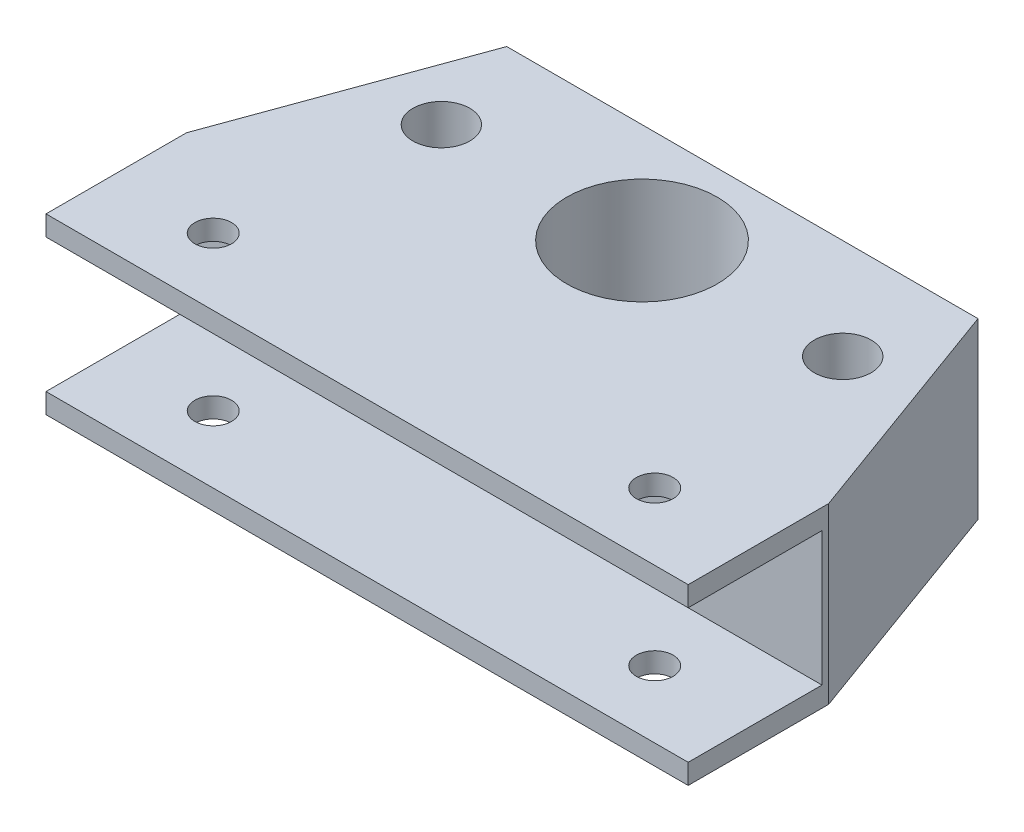
ISO-10303-21;
HEADER;
FILE_DESCRIPTION(('STEP AP214'),'2;1');
FILE_NAME('part.step','',(''),(''),'','','');
FILE_SCHEMA(('AUTOMOTIVE_DESIGN { 1 0 10303 214 1 1 1 1 }'));
ENDSEC;
DATA;
#1=APPLICATION_CONTEXT('core data for automotive mechanical design processes');
#2=APPLICATION_PROTOCOL_DEFINITION('international standard','automotive_design',2000,#1);
#3=PRODUCT_CONTEXT('',#1,'mechanical');
#4=PRODUCT('Part','Part','',(#3));
#5=PRODUCT_RELATED_PRODUCT_CATEGORY('part','',(#4));
#6=PRODUCT_DEFINITION_FORMATION('','',#4);
#7=PRODUCT_DEFINITION_CONTEXT('part definition',#1,'design');
#8=PRODUCT_DEFINITION('design','',#6,#7);
#9=PRODUCT_DEFINITION_SHAPE('','',#8);
#10=(LENGTH_UNIT() NAMED_UNIT(*) SI_UNIT(.MILLI.,.METRE.));
#11=(NAMED_UNIT(*) PLANE_ANGLE_UNIT() SI_UNIT($,.RADIAN.));
#12=(NAMED_UNIT(*) SI_UNIT($,.STERADIAN.) SOLID_ANGLE_UNIT());
#13=UNCERTAINTY_MEASURE_WITH_UNIT(LENGTH_MEASURE(1.E-05),#10,'distance_accuracy_value','');
#14=(GEOMETRIC_REPRESENTATION_CONTEXT(3) GLOBAL_UNCERTAINTY_ASSIGNED_CONTEXT((#13)) GLOBAL_UNIT_ASSIGNED_CONTEXT((#10,
#11,#12)) REPRESENTATION_CONTEXT('',''));
#15=CARTESIAN_POINT('',(0.,0.,0.));
#16=DIRECTION('',(0.,0.,1.));
#17=DIRECTION('',(1.,0.,0.));
#18=AXIS2_PLACEMENT_3D('',#15,#16,#17);
#19=CARTESIAN_POINT('',(-48.,13.,10.5));
#20=DIRECTION('',(0.,0.,-1.));
#21=DIRECTION('',(-1.,0.,0.));
#22=AXIS2_PLACEMENT_3D('',#19,#20,#21);
#23=PLANE('',#22);
#24=DIRECTION('',(0.,-1.,0.));
#25=VECTOR('',#24,1.);
#26=CARTESIAN_POINT('',(48.,13.,10.5));
#27=LINE('',#26,#25);
#28=CARTESIAN_POINT('',(48.,-9.99999999999999,10.5));
#29=VERTEX_POINT('',#28);
#30=CARTESIAN_POINT('',(48.,-13.,10.5));
#31=VERTEX_POINT('',#30);
#32=EDGE_CURVE('E163',#29,#31,#27,.T.);
#33=ORIENTED_EDGE('',*,*,#32,.F.);
#34=DIRECTION('',(-1.,0.,0.));
#35=VECTOR('',#34,1.);
#36=CARTESIAN_POINT('',(48.,-9.99999999999999,10.5));
#37=LINE('',#36,#35);
#38=CARTESIAN_POINT('',(-48.,-9.99999999999999,10.5));
#39=VERTEX_POINT('',#38);
#40=EDGE_CURVE('E207',#29,#39,#37,.T.);
#41=ORIENTED_EDGE('',*,*,#40,.T.);
#42=DIRECTION('',(0.,-1.,0.));
#43=VECTOR('',#42,1.);
#44=CARTESIAN_POINT('',(-48.,13.,10.5));
#45=LINE('',#44,#43);
#46=CARTESIAN_POINT('',(-48.,-13.,10.5));
#47=VERTEX_POINT('',#46);
#48=EDGE_CURVE('E136',#39,#47,#45,.T.);
#49=ORIENTED_EDGE('',*,*,#48,.T.);
#50=DIRECTION('',(1.,0.,0.));
#51=VECTOR('',#50,1.);
#52=CARTESIAN_POINT('',(-48.,-13.,10.5));
#53=LINE('',#52,#51);
#54=EDGE_CURVE('E157',#47,#31,#53,.T.);
#55=ORIENTED_EDGE('',*,*,#54,.T.);
#56=EDGE_LOOP('',(#33,#41,#49,#55));
#57=FACE_BOUND('',#56,.T.);
#58=ADVANCED_FACE('F41',(#57),#23,.F.);
#59=CARTESIAN_POINT('',(0.,13.,0.));
#60=DIRECTION('',(0.,1.,0.));
#61=DIRECTION('',(0.,0.,1.));
#62=AXIS2_PLACEMENT_3D('',#59,#60,#61);
#63=PLANE('',#62);
#64=CARTESIAN_POINT('',(-33.,13.,0.499999999999957));
#65=DIRECTION('',(0.,-1.,0.));
#66=DIRECTION('',(0.,0.,-1.));
#67=AXIS2_PLACEMENT_3D('',#64,#65,#66);
#68=CIRCLE('',#67,2.75);
#69=CARTESIAN_POINT('',(-33.,13.,-2.25000000000004));
#70=VERTEX_POINT('',#69);
#71=EDGE_CURVE('E170',#70,#70,#68,.T.);
#72=ORIENTED_EDGE('',*,*,#71,.T.);
#73=EDGE_LOOP('',(#72));
#74=FACE_BOUND('',#73,.T.);
#75=CARTESIAN_POINT('',(33.,13.,0.499999999999957));
#76=DIRECTION('',(0.,-1.,0.));
#77=DIRECTION('',(0.,0.,-1.));
#78=AXIS2_PLACEMENT_3D('',#75,#76,#77);
#79=CIRCLE('',#78,2.75);
#80=CARTESIAN_POINT('',(33.,13.,-2.25000000000004));
#81=VERTEX_POINT('',#80);
#82=EDGE_CURVE('E184',#81,#81,#79,.T.);
#83=ORIENTED_EDGE('',*,*,#82,.T.);
#84=EDGE_LOOP('',(#83));
#85=FACE_BOUND('',#84,.T.);
#86=CARTESIAN_POINT('',(-30.,13.,-30.5999999999998));
#87=DIRECTION('',(0.,1.,0.));
#88=DIRECTION('',(0.,0.,1.));
#89=AXIS2_PLACEMENT_3D('',#86,#87,#88);
#90=CIRCLE('',#89,4.25);
#91=CARTESIAN_POINT('',(-30.,13.,-34.8499999999998));
#92=VERTEX_POINT('',#91);
#93=EDGE_CURVE('E224',#92,#92,#90,.T.);
#94=ORIENTED_EDGE('',*,*,#93,.F.);
#95=EDGE_LOOP('',(#94));
#96=FACE_BOUND('',#95,.T.);
#97=DIRECTION('',(-0.342020143325666,0.,-0.939692620785909));
#98=VECTOR('',#97,1.);
#99=CARTESIAN_POINT('',(48.,13.,-10.5));
#100=LINE('',#99,#98);
#101=CARTESIAN_POINT('',(48.,13.,-10.5));
#102=VERTEX_POINT('',#101);
#103=CARTESIAN_POINT('',(35.2246447772564,13.,-45.6));
#104=VERTEX_POINT('',#103);
#105=EDGE_CURVE('E161',#102,#104,#100,.T.);
#106=ORIENTED_EDGE('',*,*,#105,.T.);
#107=DIRECTION('',(-1.,0.,0.));
#108=VECTOR('',#107,1.);
#109=CARTESIAN_POINT('',(35.2246447772564,13.,-45.6));
#110=LINE('',#109,#108);
#111=CARTESIAN_POINT('',(-35.2246447772564,13.,-45.6));
#112=VERTEX_POINT('',#111);
#113=EDGE_CURVE('E101',#104,#112,#110,.T.);
#114=ORIENTED_EDGE('',*,*,#113,.T.);
#115=DIRECTION('',(-0.342020143325666,0.,0.939692620785909));
#116=VECTOR('',#115,1.);
#117=CARTESIAN_POINT('',(-48.,13.,-10.5));
#118=LINE('',#117,#116);
#119=CARTESIAN_POINT('',(-48.,13.,-10.5));
#120=VERTEX_POINT('',#119);
#121=EDGE_CURVE('E119',#112,#120,#118,.T.);
#122=ORIENTED_EDGE('',*,*,#121,.T.);
#123=DIRECTION('',(0.,0.,1.));
#124=VECTOR('',#123,1.);
#125=CARTESIAN_POINT('',(-48.,13.,10.5));
#126=LINE('',#125,#124);
#127=CARTESIAN_POINT('',(-48.,13.,10.5));
#128=VERTEX_POINT('',#127);
#129=EDGE_CURVE('E111',#120,#128,#126,.T.);
#130=ORIENTED_EDGE('',*,*,#129,.T.);
#131=DIRECTION('',(1.,0.,0.));
#132=VECTOR('',#131,1.);
#133=CARTESIAN_POINT('',(-48.,13.,10.5));
#134=LINE('',#133,#132);
#135=CARTESIAN_POINT('',(48.,13.,10.5));
#136=VERTEX_POINT('',#135);
#137=EDGE_CURVE('E116',#128,#136,#134,.T.);
#138=ORIENTED_EDGE('',*,*,#137,.T.);
#139=DIRECTION('',(0.,0.,-1.));
#140=VECTOR('',#139,1.);
#141=CARTESIAN_POINT('',(48.,13.,10.5));
#142=LINE('',#141,#140);
#143=EDGE_CURVE('E67',#136,#102,#142,.T.);
#144=ORIENTED_EDGE('',*,*,#143,.T.);
#145=EDGE_LOOP('',(#106,#114,#122,#130,#138,#144));
#146=FACE_BOUND('',#145,.T.);
#147=CARTESIAN_POINT('',(0.,13.,-30.6));
#148=DIRECTION('',(0.,1.,0.));
#149=DIRECTION('',(0.,0.,1.));
#150=AXIS2_PLACEMENT_3D('',#147,#148,#149);
#151=CIRCLE('',#150,11.25);
#152=CARTESIAN_POINT('',(0.,13.,-41.85));
#153=VERTEX_POINT('',#152);
#154=EDGE_CURVE('E150',#153,#153,#151,.T.);
#155=ORIENTED_EDGE('',*,*,#154,.F.);
#156=EDGE_LOOP('',(#155));
#157=FACE_BOUND('',#156,.T.);
#158=CARTESIAN_POINT('',(30.,13.,-30.5999999999998));
#159=DIRECTION('',(0.,1.,0.));
#160=DIRECTION('',(0.,0.,-1.));
#161=AXIS2_PLACEMENT_3D('',#158,#159,#160);
#162=CIRCLE('',#161,4.25);
#163=CARTESIAN_POINT('',(30.,13.,-34.8499999999998));
#164=VERTEX_POINT('',#163);
#165=EDGE_CURVE('E218',#164,#164,#162,.T.);
#166=ORIENTED_EDGE('',*,*,#165,.F.);
#167=EDGE_LOOP('',(#166));
#168=FACE_BOUND('',#167,.T.);
#169=ADVANCED_FACE('F113',(#74,#85,#96,#146,#157,#168),#63,.T.);
#170=CARTESIAN_POINT('',(0.,-13.,0.));
#171=DIRECTION('',(0.,1.,0.));
#172=DIRECTION('',(0.,0.,1.));
#173=AXIS2_PLACEMENT_3D('',#170,#171,#172);
#174=PLANE('',#173);
#175=CARTESIAN_POINT('',(-33.,-13.,0.499999999999957));
#176=DIRECTION('',(0.,-1.,0.));
#177=DIRECTION('',(0.,0.,-1.));
#178=AXIS2_PLACEMENT_3D('',#175,#176,#177);
#179=CIRCLE('',#178,2.75);
#180=CARTESIAN_POINT('',(-33.,-13.,-2.25000000000004));
#181=VERTEX_POINT('',#180);
#182=EDGE_CURVE('E176',#181,#181,#179,.T.);
#183=ORIENTED_EDGE('',*,*,#182,.F.);
#184=EDGE_LOOP('',(#183));
#185=FACE_BOUND('',#184,.T.);
#186=CARTESIAN_POINT('',(33.,-13.,0.499999999999957));
#187=DIRECTION('',(0.,-1.,0.));
#188=DIRECTION('',(0.,0.,-1.));
#189=AXIS2_PLACEMENT_3D('',#186,#187,#188);
#190=CIRCLE('',#189,2.75);
#191=CARTESIAN_POINT('',(33.,-13.,-2.25000000000004));
#192=VERTEX_POINT('',#191);
#193=EDGE_CURVE('E181',#192,#192,#190,.T.);
#194=ORIENTED_EDGE('',*,*,#193,.F.);
#195=EDGE_LOOP('',(#194));
#196=FACE_BOUND('',#195,.T.);
#197=DIRECTION('',(-0.342020143325666,0.,-0.939692620785909));
#198=VECTOR('',#197,1.);
#199=CARTESIAN_POINT('',(48.,-13.,-10.5));
#200=LINE('',#199,#198);
#201=CARTESIAN_POINT('',(48.,-13.,-10.5));
#202=VERTEX_POINT('',#201);
#203=CARTESIAN_POINT('',(35.2246447772564,-13.,-45.6));
#204=VERTEX_POINT('',#203);
#205=EDGE_CURVE('E146',#202,#204,#200,.T.);
#206=ORIENTED_EDGE('',*,*,#205,.F.);
#207=DIRECTION('',(0.,0.,-1.));
#208=VECTOR('',#207,1.);
#209=CARTESIAN_POINT('',(48.,-13.,10.5));
#210=LINE('',#209,#208);
#211=EDGE_CURVE('E93',#31,#202,#210,.T.);
#212=ORIENTED_EDGE('',*,*,#211,.F.);
#213=ORIENTED_EDGE('',*,*,#54,.F.);
#214=DIRECTION('',(0.,0.,1.));
#215=VECTOR('',#214,1.);
#216=CARTESIAN_POINT('',(-48.,-13.,10.5));
#217=LINE('',#216,#215);
#218=CARTESIAN_POINT('',(-48.,-13.,-10.5));
#219=VERTEX_POINT('',#218);
#220=EDGE_CURVE('E154',#219,#47,#217,.T.);
#221=ORIENTED_EDGE('',*,*,#220,.F.);
#222=DIRECTION('',(-0.342020143325666,0.,0.939692620785909));
#223=VECTOR('',#222,1.);
#224=CARTESIAN_POINT('',(-48.,-13.,-10.5));
#225=LINE('',#224,#223);
#226=CARTESIAN_POINT('',(-35.2246447772564,-13.,-45.6));
#227=VERTEX_POINT('',#226);
#228=EDGE_CURVE('E152',#227,#219,#225,.T.);
#229=ORIENTED_EDGE('',*,*,#228,.F.);
#230=DIRECTION('',(-1.,0.,0.));
#231=VECTOR('',#230,1.);
#232=CARTESIAN_POINT('',(-35.2246447772564,-13.,-45.6));
#233=LINE('',#232,#231);
#234=EDGE_CURVE('E149',#204,#227,#233,.T.);
#235=ORIENTED_EDGE('',*,*,#234,.F.);
#236=EDGE_LOOP('',(#206,#212,#213,#221,#229,#235));
#237=FACE_BOUND('',#236,.T.);
#238=CARTESIAN_POINT('',(0.,-13.,-30.6));
#239=DIRECTION('',(0.,1.,0.));
#240=DIRECTION('',(0.,0.,1.));
#241=AXIS2_PLACEMENT_3D('',#238,#239,#240);
#242=CIRCLE('',#241,11.25);
#243=CARTESIAN_POINT('',(0.,-13.,-41.85));
#244=VERTEX_POINT('',#243);
#245=EDGE_CURVE('E227',#244,#244,#242,.T.);
#246=ORIENTED_EDGE('',*,*,#245,.T.);
#247=EDGE_LOOP('',(#246));
#248=FACE_BOUND('',#247,.T.);
#249=CARTESIAN_POINT('',(-30.,-13.,-30.5999999999998));
#250=DIRECTION('',(0.,1.,0.));
#251=DIRECTION('',(0.,0.,1.));
#252=AXIS2_PLACEMENT_3D('',#249,#250,#251);
#253=CIRCLE('',#252,4.25);
#254=CARTESIAN_POINT('',(-30.,-13.,-34.8499999999998));
#255=VERTEX_POINT('',#254);
#256=EDGE_CURVE('E221',#255,#255,#253,.T.);
#257=ORIENTED_EDGE('',*,*,#256,.T.);
#258=EDGE_LOOP('',(#257));
#259=FACE_BOUND('',#258,.T.);
#260=CARTESIAN_POINT('',(30.,-13.,-30.5999999999998));
#261=DIRECTION('',(0.,1.,0.));
#262=DIRECTION('',(0.,0.,-1.));
#263=AXIS2_PLACEMENT_3D('',#260,#261,#262);
#264=CIRCLE('',#263,4.25);
#265=CARTESIAN_POINT('',(30.,-13.,-34.8499999999998));
#266=VERTEX_POINT('',#265);
#267=EDGE_CURVE('E210',#266,#266,#264,.T.);
#268=ORIENTED_EDGE('',*,*,#267,.T.);
#269=EDGE_LOOP('',(#268));
#270=FACE_BOUND('',#269,.T.);
#271=ADVANCED_FACE('F245',(#185,#196,#237,#248,#259,#270),#174,.F.);
#272=CARTESIAN_POINT('',(48.,13.,-10.5));
#273=DIRECTION('',(-0.939692620785909,0.,0.342020143325666));
#274=DIRECTION('',(0.342020143325666,0.,0.939692620785909));
#275=AXIS2_PLACEMENT_3D('',#272,#273,#274);
#276=PLANE('',#275);
#277=ORIENTED_EDGE('',*,*,#205,.T.);
#278=DIRECTION('',(0.,-1.,0.));
#279=VECTOR('',#278,1.);
#280=CARTESIAN_POINT('',(35.2246447772564,13.,-45.6));
#281=LINE('',#280,#279);
#282=EDGE_CURVE('E11',#104,#204,#281,.T.);
#283=ORIENTED_EDGE('',*,*,#282,.F.);
#284=ORIENTED_EDGE('',*,*,#105,.F.);
#285=DIRECTION('',(0.,-1.,0.));
#286=VECTOR('',#285,1.);
#287=CARTESIAN_POINT('',(48.,13.,-10.5));
#288=LINE('',#287,#286);
#289=EDGE_CURVE('E142',#102,#202,#288,.T.);
#290=ORIENTED_EDGE('',*,*,#289,.T.);
#291=EDGE_LOOP('',(#277,#283,#284,#290));
#292=FACE_BOUND('',#291,.T.);
#293=ADVANCED_FACE('F43',(#292),#276,.F.);
#294=CARTESIAN_POINT('',(-35.2246447772564,13.,-45.6));
#295=DIRECTION('',(0.,0.,1.));
#296=DIRECTION('',(1.,0.,0.));
#297=AXIS2_PLACEMENT_3D('',#294,#295,#296);
#298=PLANE('',#297);
#299=ORIENTED_EDGE('',*,*,#234,.T.);
#300=DIRECTION('',(0.,-1.,0.));
#301=VECTOR('',#300,1.);
#302=CARTESIAN_POINT('',(-35.2246447772564,13.,-45.6));
#303=LINE('',#302,#301);
#304=EDGE_CURVE('E50',#112,#227,#303,.T.);
#305=ORIENTED_EDGE('',*,*,#304,.F.);
#306=ORIENTED_EDGE('',*,*,#113,.F.);
#307=ORIENTED_EDGE('',*,*,#282,.T.);
#308=EDGE_LOOP('',(#299,#305,#306,#307));
#309=FACE_BOUND('',#308,.T.);
#310=ADVANCED_FACE('F237',(#309),#298,.F.);
#311=CARTESIAN_POINT('',(-48.,13.,-10.5));
#312=DIRECTION('',(0.939692620785909,0.,0.342020143325666));
#313=DIRECTION('',(0.342020143325666,0.,-0.939692620785909));
#314=AXIS2_PLACEMENT_3D('',#311,#312,#313);
#315=PLANE('',#314);
#316=ORIENTED_EDGE('',*,*,#228,.T.);
#317=DIRECTION('',(0.,-1.,0.));
#318=VECTOR('',#317,1.);
#319=CARTESIAN_POINT('',(-48.,13.,-10.5));
#320=LINE('',#319,#318);
#321=EDGE_CURVE('E135',#120,#219,#320,.T.);
#322=ORIENTED_EDGE('',*,*,#321,.F.);
#323=ORIENTED_EDGE('',*,*,#121,.F.);
#324=ORIENTED_EDGE('',*,*,#304,.T.);
#325=EDGE_LOOP('',(#316,#322,#323,#324));
#326=FACE_BOUND('',#325,.T.);
#327=ADVANCED_FACE('F240',(#326),#315,.F.);
#328=CARTESIAN_POINT('',(-48.,13.,10.5));
#329=DIRECTION('',(1.,0.,0.));
#330=DIRECTION('',(0.,0.,-1.));
#331=AXIS2_PLACEMENT_3D('',#328,#329,#330);
#332=PLANE('',#331);
#333=ORIENTED_EDGE('',*,*,#48,.F.);
#334=DIRECTION('',(0.,0.,1.));
#335=VECTOR('',#334,1.);
#336=CARTESIAN_POINT('',(-48.,-9.99999999999999,-9.50000000000003));
#337=LINE('',#336,#335);
#338=CARTESIAN_POINT('',(-48.,-9.99999999999999,-9.50000000000003));
#339=VERTEX_POINT('',#338);
#340=EDGE_CURVE('E195',#339,#39,#337,.T.);
#341=ORIENTED_EDGE('',*,*,#340,.F.);
#342=DIRECTION('',(0.,-1.,0.));
#343=VECTOR('',#342,1.);
#344=CARTESIAN_POINT('',(-48.,9.99999999999999,-9.50000000000004));
#345=LINE('',#344,#343);
#346=CARTESIAN_POINT('',(-48.,9.99999999999999,-9.50000000000004));
#347=VERTEX_POINT('',#346);
#348=EDGE_CURVE('E202',#347,#339,#345,.T.);
#349=ORIENTED_EDGE('',*,*,#348,.F.);
#350=DIRECTION('',(0.,0.,-1.));
#351=VECTOR('',#350,1.);
#352=CARTESIAN_POINT('',(-48.,9.99999999999999,-9.50000000000004));
#353=LINE('',#352,#351);
#354=CARTESIAN_POINT('',(-48.,9.99999999999999,10.5));
#355=VERTEX_POINT('',#354);
#356=EDGE_CURVE('E132',#355,#347,#353,.T.);
#357=ORIENTED_EDGE('',*,*,#356,.F.);
#358=EDGE_CURVE('E126',#128,#355,#45,.T.);
#359=ORIENTED_EDGE('',*,*,#358,.F.);
#360=ORIENTED_EDGE('',*,*,#129,.F.);
#361=ORIENTED_EDGE('',*,*,#321,.T.);
#362=ORIENTED_EDGE('',*,*,#220,.T.);
#363=EDGE_LOOP('',(#333,#341,#349,#357,#359,#360,#361,#362));
#364=FACE_BOUND('',#363,.T.);
#365=ADVANCED_FACE('F128',(#364),#332,.F.);
#366=ORIENTED_EDGE('',*,*,#358,.T.);
#367=DIRECTION('',(-1.,0.,0.));
#368=VECTOR('',#367,1.);
#369=CARTESIAN_POINT('',(48.,9.99999999999999,10.5));
#370=LINE('',#369,#368);
#371=CARTESIAN_POINT('',(48.,9.99999999999999,10.5));
#372=VERTEX_POINT('',#371);
#373=EDGE_CURVE('E200',#372,#355,#370,.T.);
#374=ORIENTED_EDGE('',*,*,#373,.F.);
#375=EDGE_CURVE('E140',#136,#372,#27,.T.);
#376=ORIENTED_EDGE('',*,*,#375,.F.);
#377=ORIENTED_EDGE('',*,*,#137,.F.);
#378=EDGE_LOOP('',(#366,#374,#376,#377));
#379=FACE_BOUND('',#378,.T.);
#380=ADVANCED_FACE('F138',(#379),#23,.F.);
#381=CARTESIAN_POINT('',(48.,13.,10.5));
#382=DIRECTION('',(-1.,0.,0.));
#383=DIRECTION('',(0.,0.,1.));
#384=AXIS2_PLACEMENT_3D('',#381,#382,#383);
#385=PLANE('',#384);
#386=DIRECTION('',(0.,-1.,0.));
#387=VECTOR('',#386,1.);
#388=CARTESIAN_POINT('',(48.,9.99999999999999,-9.50000000000004));
#389=LINE('',#388,#387);
#390=CARTESIAN_POINT('',(48.,9.99999999999999,-9.50000000000004));
#391=VERTEX_POINT('',#390);
#392=CARTESIAN_POINT('',(48.,-9.99999999999999,-9.50000000000003));
#393=VERTEX_POINT('',#392);
#394=EDGE_CURVE('E58',#391,#393,#389,.T.);
#395=ORIENTED_EDGE('',*,*,#394,.T.);
#396=DIRECTION('',(0.,0.,1.));
#397=VECTOR('',#396,1.);
#398=CARTESIAN_POINT('',(48.,-9.99999999999999,-9.50000000000003));
#399=LINE('',#398,#397);
#400=EDGE_CURVE('E197',#393,#29,#399,.T.);
#401=ORIENTED_EDGE('',*,*,#400,.T.);
#402=ORIENTED_EDGE('',*,*,#32,.T.);
#403=ORIENTED_EDGE('',*,*,#211,.T.);
#404=ORIENTED_EDGE('',*,*,#289,.F.);
#405=ORIENTED_EDGE('',*,*,#143,.F.);
#406=ORIENTED_EDGE('',*,*,#375,.T.);
#407=DIRECTION('',(0.,0.,-1.));
#408=VECTOR('',#407,1.);
#409=CARTESIAN_POINT('',(48.,9.99999999999999,-9.50000000000004));
#410=LINE('',#409,#408);
#411=EDGE_CURVE('E192',#372,#391,#410,.T.);
#412=ORIENTED_EDGE('',*,*,#411,.T.);
#413=EDGE_LOOP('',(#395,#401,#402,#403,#404,#405,#406,#412));
#414=FACE_BOUND('',#413,.T.);
#415=ADVANCED_FACE('F265',(#414),#385,.F.);
#416=CARTESIAN_POINT('',(0.,13.,-30.6));
#417=DIRECTION('',(0.,-1.,0.));
#418=DIRECTION('',(0.,0.,-1.));
#419=AXIS2_PLACEMENT_3D('',#416,#417,#418);
#420=CYLINDRICAL_SURFACE('',#419,11.25);
#421=CARTESIAN_POINT('',(0.,13.,-41.85));
#422=CARTESIAN_POINT('',(0.,12.7291666666667,-41.85));
#423=CARTESIAN_POINT('',(0.,12.4583333333333,-41.85));
#424=CARTESIAN_POINT('',(0.,11.9166666666667,-41.85));
#425=CARTESIAN_POINT('',(0.,11.6458333333333,-41.85));
#426=CARTESIAN_POINT('',(0.,11.1041666666667,-41.85));
#427=CARTESIAN_POINT('',(0.,10.8333333333333,-41.85));
#428=CARTESIAN_POINT('',(0.,10.2916666666667,-41.85));
#429=CARTESIAN_POINT('',(0.,10.0208333333333,-41.85));
#430=CARTESIAN_POINT('',(0.,9.47916666666667,-41.85));
#431=CARTESIAN_POINT('',(0.,9.20833333333333,-41.85));
#432=CARTESIAN_POINT('',(0.,8.66666666666667,-41.85));
#433=CARTESIAN_POINT('',(0.,8.39583333333333,-41.85));
#434=CARTESIAN_POINT('',(0.,7.85416666666667,-41.85));
#435=CARTESIAN_POINT('',(0.,7.58333333333333,-41.85));
#436=CARTESIAN_POINT('',(0.,7.04166666666667,-41.85));
#437=CARTESIAN_POINT('',(0.,6.77083333333333,-41.85));
#438=CARTESIAN_POINT('',(0.,6.22916666666667,-41.85));
#439=CARTESIAN_POINT('',(0.,5.95833333333333,-41.85));
#440=CARTESIAN_POINT('',(0.,5.41666666666667,-41.85));
#441=CARTESIAN_POINT('',(0.,5.14583333333333,-41.85));
#442=CARTESIAN_POINT('',(0.,4.60416666666667,-41.85));
#443=CARTESIAN_POINT('',(0.,4.33333333333333,-41.85));
#444=CARTESIAN_POINT('',(0.,3.79166666666667,-41.85));
#445=CARTESIAN_POINT('',(0.,3.52083333333333,-41.85));
#446=CARTESIAN_POINT('',(0.,2.97916666666666,-41.85));
#447=CARTESIAN_POINT('',(0.,2.70833333333333,-41.85));
#448=CARTESIAN_POINT('',(0.,2.16666666666667,-41.85));
#449=CARTESIAN_POINT('',(0.,1.89583333333333,-41.85));
#450=CARTESIAN_POINT('',(0.,1.35416666666666,-41.85));
#451=CARTESIAN_POINT('',(0.,1.08333333333333,-41.85));
#452=CARTESIAN_POINT('',(0.,0.541666666666665,-41.85));
#453=CARTESIAN_POINT('',(0.,0.270833333333332,-41.85));
#454=CARTESIAN_POINT('',(0.,-0.270833333333335,-41.85));
#455=CARTESIAN_POINT('',(0.,-0.541666666666669,-41.85));
#456=CARTESIAN_POINT('',(0.,-1.08333333333334,-41.85));
#457=CARTESIAN_POINT('',(0.,-1.35416666666667,-41.85));
#458=CARTESIAN_POINT('',(0.,-1.89583333333333,-41.85));
#459=CARTESIAN_POINT('',(0.,-2.16666666666667,-41.85));
#460=CARTESIAN_POINT('',(0.,-2.70833333333333,-41.85));
#461=CARTESIAN_POINT('',(0.,-2.97916666666667,-41.85));
#462=CARTESIAN_POINT('',(0.,-3.52083333333333,-41.85));
#463=CARTESIAN_POINT('',(0.,-3.79166666666667,-41.85));
#464=CARTESIAN_POINT('',(0.,-4.33333333333333,-41.85));
#465=CARTESIAN_POINT('',(0.,-4.60416666666667,-41.85));
#466=CARTESIAN_POINT('',(0.,-5.14583333333333,-41.85));
#467=CARTESIAN_POINT('',(0.,-5.41666666666667,-41.85));
#468=CARTESIAN_POINT('',(0.,-5.95833333333333,-41.85));
#469=CARTESIAN_POINT('',(0.,-6.22916666666667,-41.85));
#470=CARTESIAN_POINT('',(0.,-6.77083333333333,-41.85));
#471=CARTESIAN_POINT('',(0.,-7.04166666666667,-41.85));
#472=CARTESIAN_POINT('',(0.,-7.58333333333333,-41.85));
#473=CARTESIAN_POINT('',(0.,-7.85416666666667,-41.85));
#474=CARTESIAN_POINT('',(0.,-8.39583333333333,-41.85));
#475=CARTESIAN_POINT('',(0.,-8.66666666666667,-41.85));
#476=CARTESIAN_POINT('',(0.,-9.20833333333333,-41.85));
#477=CARTESIAN_POINT('',(0.,-9.47916666666667,-41.85));
#478=CARTESIAN_POINT('',(0.,-10.0208333333333,-41.85));
#479=CARTESIAN_POINT('',(0.,-10.2916666666667,-41.85));
#480=CARTESIAN_POINT('',(0.,-10.8333333333333,-41.85));
#481=CARTESIAN_POINT('',(0.,-11.1041666666667,-41.85));
#482=CARTESIAN_POINT('',(0.,-11.6458333333333,-41.85));
#483=CARTESIAN_POINT('',(0.,-11.9166666666667,-41.85));
#484=CARTESIAN_POINT('',(0.,-12.4583333333333,-41.85));
#485=CARTESIAN_POINT('',(0.,-12.7291666666667,-41.85));
#486=CARTESIAN_POINT('',(0.,-13.,-41.85));
#487=B_SPLINE_CURVE_WITH_KNOTS('',3,(#421,#422,#423,#424,#425,#426,#427,#428,#429,#430,#431,
#432,#433,#434,#435,#436,#437,#438,#439,#440,#441,#442,#443,#444,#445,#446,#447,#448,#449,#450,
#451,#452,#453,#454,#455,#456,#457,#458,#459,#460,#461,#462,#463,#464,#465,#466,#467,#468,#469,
#470,#471,#472,#473,#474,#475,#476,#477,#478,#479,#480,#481,#482,#483,#484,#485,#486),
.UNSPECIFIED.,.F.,.F.,(4,2,2,2,2,2,2,2,2,2,2,2,2,2,2,2,2,2,2,2,2,2,2,2,2,2,2,2,2,2,2,2,4),(0.,
0.812499999999999,1.625,2.4375,3.25,4.0625,4.875,5.6875,6.5,7.3125,8.125,8.9375,9.75,10.5625,
11.375,12.1875,13.,13.8125,14.625,15.4375,16.25,17.0625,17.875,18.6875,19.5,20.3125,21.125,
21.9375,22.75,23.5625,24.375,25.1875,26.),.UNSPECIFIED.);
#488=EDGE_CURVE('BSEAM299',#153,#244,#487,.T.);
#489=ORIENTED_EDGE('',*,*,#154,.T.);
#490=ORIENTED_EDGE('',*,*,#245,.F.);
#491=ORIENTED_EDGE('',*,*,#488,.T.);
#492=ORIENTED_EDGE('',*,*,#488,.F.);
#493=EDGE_LOOP('',(#489,#491,#490,#492));
#494=FACE_BOUND('',#493,.T.);
#495=ADVANCED_FACE('F299',(#494),#420,.F.);
#496=CARTESIAN_POINT('',(-30.,13.,-30.5999999999998));
#497=DIRECTION('',(0.,-1.,0.));
#498=DIRECTION('',(0.,0.,-1.));
#499=AXIS2_PLACEMENT_3D('',#496,#497,#498);
#500=CYLINDRICAL_SURFACE('',#499,4.25);
#501=CARTESIAN_POINT('',(-30.,13.,-34.8499999999998));
#502=CARTESIAN_POINT('',(-30.,12.7291666666667,-34.8499999999998));
#503=CARTESIAN_POINT('',(-30.,12.4583333333333,-34.8499999999998));
#504=CARTESIAN_POINT('',(-30.,11.9166666666667,-34.8499999999998));
#505=CARTESIAN_POINT('',(-30.,11.6458333333333,-34.8499999999998));
#506=CARTESIAN_POINT('',(-30.,11.1041666666667,-34.8499999999998));
#507=CARTESIAN_POINT('',(-30.,10.8333333333333,-34.8499999999998));
#508=CARTESIAN_POINT('',(-30.,10.2916666666667,-34.8499999999998));
#509=CARTESIAN_POINT('',(-30.,10.0208333333333,-34.8499999999998));
#510=CARTESIAN_POINT('',(-30.,9.47916666666667,-34.8499999999998));
#511=CARTESIAN_POINT('',(-30.,9.20833333333333,-34.8499999999998));
#512=CARTESIAN_POINT('',(-30.,8.66666666666667,-34.8499999999998));
#513=CARTESIAN_POINT('',(-30.,8.39583333333333,-34.8499999999998));
#514=CARTESIAN_POINT('',(-30.,7.85416666666667,-34.8499999999998));
#515=CARTESIAN_POINT('',(-30.,7.58333333333333,-34.8499999999998));
#516=CARTESIAN_POINT('',(-30.,7.04166666666667,-34.8499999999998));
#517=CARTESIAN_POINT('',(-30.,6.77083333333333,-34.8499999999998));
#518=CARTESIAN_POINT('',(-30.,6.22916666666667,-34.8499999999998));
#519=CARTESIAN_POINT('',(-30.,5.95833333333333,-34.8499999999998));
#520=CARTESIAN_POINT('',(-30.,5.41666666666667,-34.8499999999998));
#521=CARTESIAN_POINT('',(-30.,5.14583333333333,-34.8499999999998));
#522=CARTESIAN_POINT('',(-30.,4.60416666666667,-34.8499999999998));
#523=CARTESIAN_POINT('',(-30.,4.33333333333333,-34.8499999999998));
#524=CARTESIAN_POINT('',(-30.,3.79166666666667,-34.8499999999998));
#525=CARTESIAN_POINT('',(-30.,3.52083333333333,-34.8499999999998));
#526=CARTESIAN_POINT('',(-30.,2.97916666666666,-34.8499999999998));
#527=CARTESIAN_POINT('',(-30.,2.70833333333333,-34.8499999999998));
#528=CARTESIAN_POINT('',(-30.,2.16666666666667,-34.8499999999998));
#529=CARTESIAN_POINT('',(-30.,1.89583333333333,-34.8499999999998));
#530=CARTESIAN_POINT('',(-30.,1.35416666666666,-34.8499999999998));
#531=CARTESIAN_POINT('',(-30.,1.08333333333333,-34.8499999999998));
#532=CARTESIAN_POINT('',(-30.,0.541666666666665,-34.8499999999998));
#533=CARTESIAN_POINT('',(-30.,0.270833333333332,-34.8499999999998));
#534=CARTESIAN_POINT('',(-30.,-0.270833333333335,-34.8499999999998));
#535=CARTESIAN_POINT('',(-30.,-0.541666666666669,-34.8499999999998));
#536=CARTESIAN_POINT('',(-30.,-1.08333333333334,-34.8499999999998));
#537=CARTESIAN_POINT('',(-30.,-1.35416666666667,-34.8499999999998));
#538=CARTESIAN_POINT('',(-30.,-1.89583333333333,-34.8499999999998));
#539=CARTESIAN_POINT('',(-30.,-2.16666666666667,-34.8499999999998));
#540=CARTESIAN_POINT('',(-30.,-2.70833333333333,-34.8499999999998));
#541=CARTESIAN_POINT('',(-30.,-2.97916666666667,-34.8499999999998));
#542=CARTESIAN_POINT('',(-30.,-3.52083333333333,-34.8499999999998));
#543=CARTESIAN_POINT('',(-30.,-3.79166666666667,-34.8499999999998));
#544=CARTESIAN_POINT('',(-30.,-4.33333333333333,-34.8499999999998));
#545=CARTESIAN_POINT('',(-30.,-4.60416666666667,-34.8499999999998));
#546=CARTESIAN_POINT('',(-30.,-5.14583333333333,-34.8499999999998));
#547=CARTESIAN_POINT('',(-30.,-5.41666666666667,-34.8499999999998));
#548=CARTESIAN_POINT('',(-30.,-5.95833333333333,-34.8499999999998));
#549=CARTESIAN_POINT('',(-30.,-6.22916666666667,-34.8499999999998));
#550=CARTESIAN_POINT('',(-30.,-6.77083333333333,-34.8499999999998));
#551=CARTESIAN_POINT('',(-30.,-7.04166666666667,-34.8499999999998));
#552=CARTESIAN_POINT('',(-30.,-7.58333333333333,-34.8499999999998));
#553=CARTESIAN_POINT('',(-30.,-7.85416666666667,-34.8499999999998));
#554=CARTESIAN_POINT('',(-30.,-8.39583333333333,-34.8499999999998));
#555=CARTESIAN_POINT('',(-30.,-8.66666666666667,-34.8499999999998));
#556=CARTESIAN_POINT('',(-30.,-9.20833333333333,-34.8499999999998));
#557=CARTESIAN_POINT('',(-30.,-9.47916666666667,-34.8499999999998));
#558=CARTESIAN_POINT('',(-30.,-10.0208333333333,-34.8499999999998));
#559=CARTESIAN_POINT('',(-30.,-10.2916666666667,-34.8499999999998));
#560=CARTESIAN_POINT('',(-30.,-10.8333333333333,-34.8499999999998));
#561=CARTESIAN_POINT('',(-30.,-11.1041666666667,-34.8499999999998));
#562=CARTESIAN_POINT('',(-30.,-11.6458333333333,-34.8499999999998));
#563=CARTESIAN_POINT('',(-30.,-11.9166666666667,-34.8499999999998));
#564=CARTESIAN_POINT('',(-30.,-12.4583333333333,-34.8499999999998));
#565=CARTESIAN_POINT('',(-30.,-12.7291666666667,-34.8499999999998));
#566=CARTESIAN_POINT('',(-30.,-13.,-34.8499999999998));
#567=B_SPLINE_CURVE_WITH_KNOTS('',3,(#501,#502,#503,#504,#505,#506,#507,#508,#509,#510,#511,
#512,#513,#514,#515,#516,#517,#518,#519,#520,#521,#522,#523,#524,#525,#526,#527,#528,#529,#530,
#531,#532,#533,#534,#535,#536,#537,#538,#539,#540,#541,#542,#543,#544,#545,#546,#547,#548,#549,
#550,#551,#552,#553,#554,#555,#556,#557,#558,#559,#560,#561,#562,#563,#564,#565,#566),
.UNSPECIFIED.,.F.,.F.,(4,2,2,2,2,2,2,2,2,2,2,2,2,2,2,2,2,2,2,2,2,2,2,2,2,2,2,2,2,2,2,2,4),(0.,
0.812499999999999,1.625,2.4375,3.25,4.0625,4.875,5.6875,6.5,7.3125,8.125,8.9375,9.75,10.5625,
11.375,12.1875,13.,13.8125,14.625,15.4375,16.25,17.0625,17.875,18.6875,19.5,20.3125,21.125,
21.9375,22.75,23.5625,24.375,25.1875,26.),.UNSPECIFIED.);
#568=EDGE_CURVE('BSEAM321',#92,#255,#567,.T.);
#569=ORIENTED_EDGE('',*,*,#93,.T.);
#570=ORIENTED_EDGE('',*,*,#256,.F.);
#571=ORIENTED_EDGE('',*,*,#568,.T.);
#572=ORIENTED_EDGE('',*,*,#568,.F.);
#573=EDGE_LOOP('',(#569,#571,#570,#572));
#574=FACE_BOUND('',#573,.T.);
#575=ADVANCED_FACE('F321',(#574),#500,.F.);
#576=CARTESIAN_POINT('',(30.,13.,-30.5999999999998));
#577=DIRECTION('',(0.,-1.,0.));
#578=DIRECTION('',(0.,0.,-1.));
#579=AXIS2_PLACEMENT_3D('',#576,#577,#578);
#580=CYLINDRICAL_SURFACE('',#579,4.25);
#581=CARTESIAN_POINT('',(30.,13.,-34.8499999999998));
#582=CARTESIAN_POINT('',(30.,12.7291666666667,-34.8499999999998));
#583=CARTESIAN_POINT('',(30.,12.4583333333333,-34.8499999999998));
#584=CARTESIAN_POINT('',(30.,11.9166666666667,-34.8499999999998));
#585=CARTESIAN_POINT('',(30.,11.6458333333333,-34.8499999999998));
#586=CARTESIAN_POINT('',(30.,11.1041666666667,-34.8499999999998));
#587=CARTESIAN_POINT('',(30.,10.8333333333333,-34.8499999999998));
#588=CARTESIAN_POINT('',(30.,10.2916666666667,-34.8499999999998));
#589=CARTESIAN_POINT('',(30.,10.0208333333333,-34.8499999999998));
#590=CARTESIAN_POINT('',(30.,9.47916666666667,-34.8499999999998));
#591=CARTESIAN_POINT('',(30.,9.20833333333333,-34.8499999999998));
#592=CARTESIAN_POINT('',(30.,8.66666666666667,-34.8499999999998));
#593=CARTESIAN_POINT('',(30.,8.39583333333333,-34.8499999999998));
#594=CARTESIAN_POINT('',(30.,7.85416666666667,-34.8499999999998));
#595=CARTESIAN_POINT('',(30.,7.58333333333333,-34.8499999999998));
#596=CARTESIAN_POINT('',(30.,7.04166666666667,-34.8499999999998));
#597=CARTESIAN_POINT('',(30.,6.77083333333333,-34.8499999999998));
#598=CARTESIAN_POINT('',(30.,6.22916666666667,-34.8499999999998));
#599=CARTESIAN_POINT('',(30.,5.95833333333333,-34.8499999999998));
#600=CARTESIAN_POINT('',(30.,5.41666666666667,-34.8499999999998));
#601=CARTESIAN_POINT('',(30.,5.14583333333333,-34.8499999999998));
#602=CARTESIAN_POINT('',(30.,4.60416666666667,-34.8499999999998));
#603=CARTESIAN_POINT('',(30.,4.33333333333333,-34.8499999999998));
#604=CARTESIAN_POINT('',(30.,3.79166666666667,-34.8499999999998));
#605=CARTESIAN_POINT('',(30.,3.52083333333333,-34.8499999999998));
#606=CARTESIAN_POINT('',(30.,2.97916666666666,-34.8499999999998));
#607=CARTESIAN_POINT('',(30.,2.70833333333333,-34.8499999999998));
#608=CARTESIAN_POINT('',(30.,2.16666666666667,-34.8499999999998));
#609=CARTESIAN_POINT('',(30.,1.89583333333333,-34.8499999999998));
#610=CARTESIAN_POINT('',(30.,1.35416666666666,-34.8499999999998));
#611=CARTESIAN_POINT('',(30.,1.08333333333333,-34.8499999999998));
#612=CARTESIAN_POINT('',(30.,0.541666666666665,-34.8499999999998));
#613=CARTESIAN_POINT('',(30.,0.270833333333332,-34.8499999999998));
#614=CARTESIAN_POINT('',(30.,-0.270833333333335,-34.8499999999998));
#615=CARTESIAN_POINT('',(30.,-0.541666666666669,-34.8499999999998));
#616=CARTESIAN_POINT('',(30.,-1.08333333333334,-34.8499999999998));
#617=CARTESIAN_POINT('',(30.,-1.35416666666667,-34.8499999999998));
#618=CARTESIAN_POINT('',(30.,-1.89583333333333,-34.8499999999998));
#619=CARTESIAN_POINT('',(30.,-2.16666666666667,-34.8499999999998));
#620=CARTESIAN_POINT('',(30.,-2.70833333333333,-34.8499999999998));
#621=CARTESIAN_POINT('',(30.,-2.97916666666667,-34.8499999999998));
#622=CARTESIAN_POINT('',(30.,-3.52083333333333,-34.8499999999998));
#623=CARTESIAN_POINT('',(30.,-3.79166666666667,-34.8499999999998));
#624=CARTESIAN_POINT('',(30.,-4.33333333333333,-34.8499999999998));
#625=CARTESIAN_POINT('',(30.,-4.60416666666667,-34.8499999999998));
#626=CARTESIAN_POINT('',(30.,-5.14583333333333,-34.8499999999998));
#627=CARTESIAN_POINT('',(30.,-5.41666666666667,-34.8499999999998));
#628=CARTESIAN_POINT('',(30.,-5.95833333333333,-34.8499999999998));
#629=CARTESIAN_POINT('',(30.,-6.22916666666667,-34.8499999999998));
#630=CARTESIAN_POINT('',(30.,-6.77083333333333,-34.8499999999998));
#631=CARTESIAN_POINT('',(30.,-7.04166666666667,-34.8499999999998));
#632=CARTESIAN_POINT('',(30.,-7.58333333333333,-34.8499999999998));
#633=CARTESIAN_POINT('',(30.,-7.85416666666667,-34.8499999999998));
#634=CARTESIAN_POINT('',(30.,-8.39583333333333,-34.8499999999998));
#635=CARTESIAN_POINT('',(30.,-8.66666666666667,-34.8499999999998));
#636=CARTESIAN_POINT('',(30.,-9.20833333333333,-34.8499999999998));
#637=CARTESIAN_POINT('',(30.,-9.47916666666667,-34.8499999999998));
#638=CARTESIAN_POINT('',(30.,-10.0208333333333,-34.8499999999998));
#639=CARTESIAN_POINT('',(30.,-10.2916666666667,-34.8499999999998));
#640=CARTESIAN_POINT('',(30.,-10.8333333333333,-34.8499999999998));
#641=CARTESIAN_POINT('',(30.,-11.1041666666667,-34.8499999999998));
#642=CARTESIAN_POINT('',(30.,-11.6458333333333,-34.8499999999998));
#643=CARTESIAN_POINT('',(30.,-11.9166666666667,-34.8499999999998));
#644=CARTESIAN_POINT('',(30.,-12.4583333333333,-34.8499999999998));
#645=CARTESIAN_POINT('',(30.,-12.7291666666667,-34.8499999999998));
#646=CARTESIAN_POINT('',(30.,-13.,-34.8499999999998));
#647=B_SPLINE_CURVE_WITH_KNOTS('',3,(#581,#582,#583,#584,#585,#586,#587,#588,#589,#590,#591,
#592,#593,#594,#595,#596,#597,#598,#599,#600,#601,#602,#603,#604,#605,#606,#607,#608,#609,#610,
#611,#612,#613,#614,#615,#616,#617,#618,#619,#620,#621,#622,#623,#624,#625,#626,#627,#628,#629,
#630,#631,#632,#633,#634,#635,#636,#637,#638,#639,#640,#641,#642,#643,#644,#645,#646),
.UNSPECIFIED.,.F.,.F.,(4,2,2,2,2,2,2,2,2,2,2,2,2,2,2,2,2,2,2,2,2,2,2,2,2,2,2,2,2,2,2,2,4),(0.,
0.812499999999999,1.625,2.4375,3.25,4.0625,4.875,5.6875,6.5,7.3125,8.125,8.9375,9.75,10.5625,
11.375,12.1875,13.,13.8125,14.625,15.4375,16.25,17.0625,17.875,18.6875,19.5,20.3125,21.125,
21.9375,22.75,23.5625,24.375,25.1875,26.),.UNSPECIFIED.);
#648=EDGE_CURVE('BSEAM324',#164,#266,#647,.T.);
#649=ORIENTED_EDGE('',*,*,#165,.T.);
#650=ORIENTED_EDGE('',*,*,#267,.F.);
#651=ORIENTED_EDGE('',*,*,#648,.T.);
#652=ORIENTED_EDGE('',*,*,#648,.F.);
#653=EDGE_LOOP('',(#649,#651,#650,#652));
#654=FACE_BOUND('',#653,.T.);
#655=ADVANCED_FACE('F324',(#654),#580,.F.);
#656=CARTESIAN_POINT('',(48.,-9.99999999999999,-9.50000000000003));
#657=DIRECTION('',(0.,-1.,0.));
#658=DIRECTION('',(0.,0.,-1.));
#659=AXIS2_PLACEMENT_3D('',#656,#657,#658);
#660=PLANE('',#659);
#661=CARTESIAN_POINT('',(-33.,-9.99999999999999,0.499999999999957));
#662=DIRECTION('',(0.,-1.,0.));
#663=DIRECTION('',(0.,0.,-1.));
#664=AXIS2_PLACEMENT_3D('',#661,#662,#663);
#665=CIRCLE('',#664,2.75);
#666=CARTESIAN_POINT('',(-33.,-9.99999999999999,-2.25000000000004));
#667=VERTEX_POINT('',#666);
#668=EDGE_CURVE('E189',#667,#667,#665,.T.);
#669=ORIENTED_EDGE('',*,*,#668,.T.);
#670=EDGE_LOOP('',(#669));
#671=FACE_BOUND('',#670,.T.);
#672=CARTESIAN_POINT('',(33.,-9.99999999999999,0.499999999999957));
#673=DIRECTION('',(0.,-1.,0.));
#674=DIRECTION('',(0.,0.,-1.));
#675=AXIS2_PLACEMENT_3D('',#672,#673,#674);
#676=CIRCLE('',#675,2.75);
#677=CARTESIAN_POINT('',(33.,-9.99999999999999,-2.25000000000004));
#678=VERTEX_POINT('',#677);
#679=EDGE_CURVE('E169',#678,#678,#676,.T.);
#680=ORIENTED_EDGE('',*,*,#679,.T.);
#681=EDGE_LOOP('',(#680));
#682=FACE_BOUND('',#681,.T.);
#683=ORIENTED_EDGE('',*,*,#340,.T.);
#684=ORIENTED_EDGE('',*,*,#40,.F.);
#685=ORIENTED_EDGE('',*,*,#400,.F.);
#686=DIRECTION('',(-1.,0.,0.));
#687=VECTOR('',#686,1.);
#688=CARTESIAN_POINT('',(48.,-9.99999999999999,-9.50000000000003));
#689=LINE('',#688,#687);
#690=EDGE_CURVE('E211',#393,#339,#689,.T.);
#691=ORIENTED_EDGE('',*,*,#690,.T.);
#692=EDGE_LOOP('',(#683,#684,#685,#691));
#693=FACE_BOUND('',#692,.T.);
#694=ADVANCED_FACE('F264',(#671,#682,#693),#660,.F.);
#695=CARTESIAN_POINT('',(48.,9.99999999999999,-9.50000000000004));
#696=DIRECTION('',(0.,0.,-1.));
#697=DIRECTION('',(0.,1.,0.));
#698=AXIS2_PLACEMENT_3D('',#695,#696,#697);
#699=PLANE('',#698);
#700=ORIENTED_EDGE('',*,*,#348,.T.);
#701=ORIENTED_EDGE('',*,*,#690,.F.);
#702=ORIENTED_EDGE('',*,*,#394,.F.);
#703=DIRECTION('',(-1.,0.,0.));
#704=VECTOR('',#703,1.);
#705=CARTESIAN_POINT('',(48.,9.99999999999999,-9.50000000000004));
#706=LINE('',#705,#704);
#707=EDGE_CURVE('E214',#391,#347,#706,.T.);
#708=ORIENTED_EDGE('',*,*,#707,.T.);
#709=EDGE_LOOP('',(#700,#701,#702,#708));
#710=FACE_BOUND('',#709,.T.);
#711=ADVANCED_FACE('F263',(#710),#699,.F.);
#712=CARTESIAN_POINT('',(48.,9.99999999999999,-9.50000000000004));
#713=DIRECTION('',(0.,1.,0.));
#714=DIRECTION('',(0.,0.,1.));
#715=AXIS2_PLACEMENT_3D('',#712,#713,#714);
#716=PLANE('',#715);
#717=CARTESIAN_POINT('',(-33.,9.99999999999999,0.499999999999957));
#718=DIRECTION('',(0.,1.,0.));
#719=DIRECTION('',(0.,0.,1.));
#720=AXIS2_PLACEMENT_3D('',#717,#718,#719);
#721=CIRCLE('',#720,2.75);
#722=CARTESIAN_POINT('',(-33.,9.99999999999999,3.24999999999996));
#723=VERTEX_POINT('',#722);
#724=EDGE_CURVE('E45',#723,#723,#721,.T.);
#725=ORIENTED_EDGE('',*,*,#724,.T.);
#726=EDGE_LOOP('',(#725));
#727=FACE_BOUND('',#726,.T.);
#728=CARTESIAN_POINT('',(33.,9.99999999999999,0.499999999999957));
#729=DIRECTION('',(0.,1.,0.));
#730=DIRECTION('',(0.,0.,1.));
#731=AXIS2_PLACEMENT_3D('',#728,#729,#730);
#732=CIRCLE('',#731,2.75);
#733=CARTESIAN_POINT('',(33.,9.99999999999999,3.24999999999996));
#734=VERTEX_POINT('',#733);
#735=EDGE_CURVE('E167',#734,#734,#732,.T.);
#736=ORIENTED_EDGE('',*,*,#735,.T.);
#737=EDGE_LOOP('',(#736));
#738=FACE_BOUND('',#737,.T.);
#739=ORIENTED_EDGE('',*,*,#356,.T.);
#740=ORIENTED_EDGE('',*,*,#707,.F.);
#741=ORIENTED_EDGE('',*,*,#411,.F.);
#742=ORIENTED_EDGE('',*,*,#373,.T.);
#743=EDGE_LOOP('',(#739,#740,#741,#742));
#744=FACE_BOUND('',#743,.T.);
#745=ADVANCED_FACE('F267',(#727,#738,#744),#716,.F.);
#746=CARTESIAN_POINT('',(33.,13.,0.499999999999957));
#747=DIRECTION('',(0.,-1.,0.));
#748=DIRECTION('',(0.,0.,-1.));
#749=AXIS2_PLACEMENT_3D('',#746,#747,#748);
#750=CYLINDRICAL_SURFACE('',#749,2.75);
#751=ORIENTED_EDGE('',*,*,#82,.F.);
#752=EDGE_LOOP('',(#751));
#753=FACE_BOUND('',#752,.T.);
#754=ORIENTED_EDGE('',*,*,#735,.F.);
#755=EDGE_LOOP('',(#754));
#756=FACE_BOUND('',#755,.T.);
#757=ADVANCED_FACE('F269',(#753,#756),#750,.F.);
#758=CARTESIAN_POINT('',(-33.,13.,0.499999999999957));
#759=DIRECTION('',(0.,-1.,0.));
#760=DIRECTION('',(0.,0.,-1.));
#761=AXIS2_PLACEMENT_3D('',#758,#759,#760);
#762=CYLINDRICAL_SURFACE('',#761,2.75);
#763=ORIENTED_EDGE('',*,*,#71,.F.);
#764=EDGE_LOOP('',(#763));
#765=FACE_BOUND('',#764,.T.);
#766=ORIENTED_EDGE('',*,*,#724,.F.);
#767=EDGE_LOOP('',(#766));
#768=FACE_BOUND('',#767,.T.);
#769=ADVANCED_FACE('F277',(#765,#768),#762,.F.);
#770=ORIENTED_EDGE('',*,*,#193,.T.);
#771=EDGE_LOOP('',(#770));
#772=FACE_BOUND('',#771,.T.);
#773=ORIENTED_EDGE('',*,*,#679,.F.);
#774=EDGE_LOOP('',(#773));
#775=FACE_BOUND('',#774,.T.);
#776=ADVANCED_FACE('F280',(#772,#775),#750,.F.);
#777=ORIENTED_EDGE('',*,*,#182,.T.);
#778=EDGE_LOOP('',(#777));
#779=FACE_BOUND('',#778,.T.);
#780=ORIENTED_EDGE('',*,*,#668,.F.);
#781=EDGE_LOOP('',(#780));
#782=FACE_BOUND('',#781,.T.);
#783=ADVANCED_FACE('F342',(#779,#782),#762,.F.);
#784=CLOSED_SHELL('',(#58,#169,#271,#293,#310,#327,#365,#380,#415,#495,#575,#655,#694,#711,#745,
#757,#769,#776,#783));
#785=MANIFOLD_SOLID_BREP('B2',#784);
#786=ADVANCED_BREP_SHAPE_REPRESENTATION('',(#18,#785),#14);
#787=SHAPE_DEFINITION_REPRESENTATION(#9,#786);
ENDSEC;
END-ISO-10303-21;
